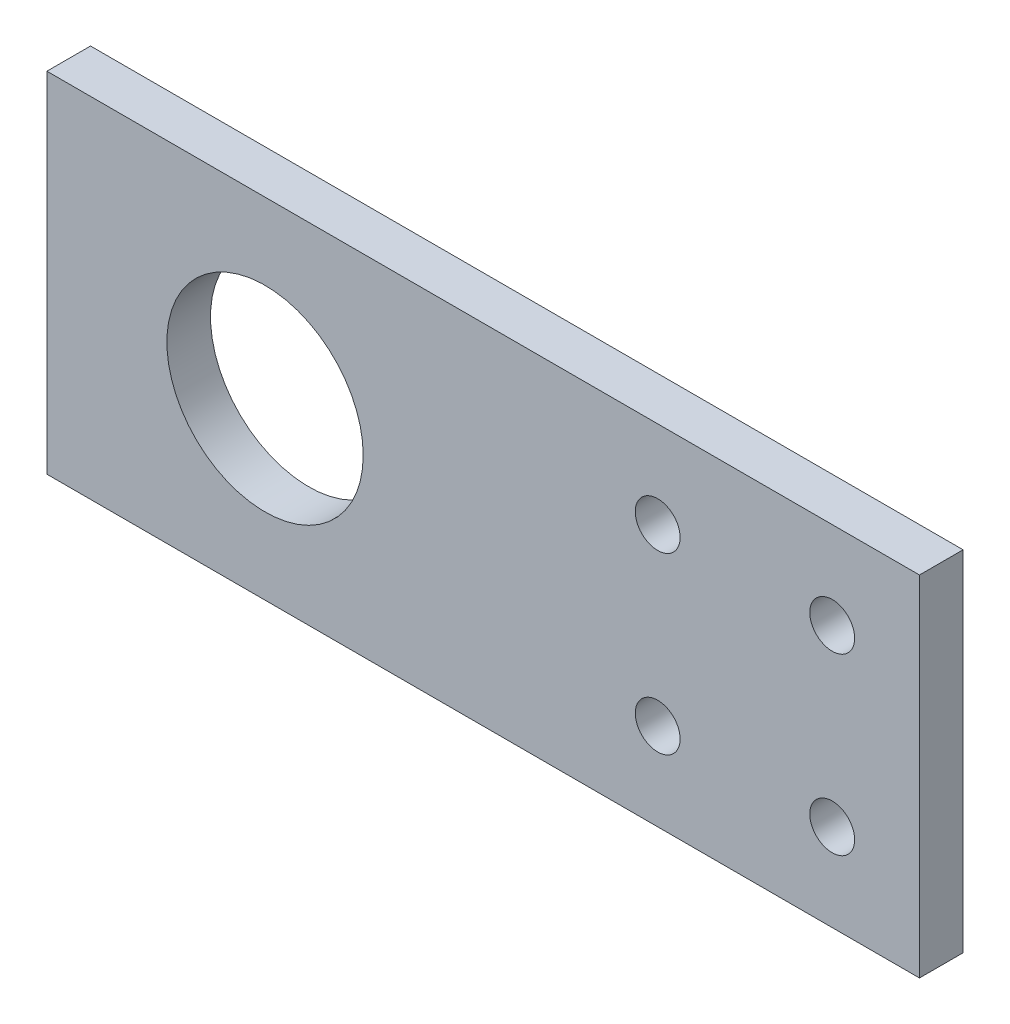
ISO-10303-21;
HEADER;
FILE_DESCRIPTION(('STEP AP214'),'2;1');
FILE_NAME('part.step','',(''),(''),'','','');
FILE_SCHEMA(('AUTOMOTIVE_DESIGN { 1 0 10303 214 1 1 1 1 }'));
ENDSEC;
DATA;
#1=APPLICATION_CONTEXT('core data for automotive mechanical design processes');
#2=APPLICATION_PROTOCOL_DEFINITION('international standard','automotive_design',2000,#1);
#3=PRODUCT_CONTEXT('',#1,'mechanical');
#4=PRODUCT('Part','Part','',(#3));
#5=PRODUCT_RELATED_PRODUCT_CATEGORY('part','',(#4));
#6=PRODUCT_DEFINITION_FORMATION('','',#4);
#7=PRODUCT_DEFINITION_CONTEXT('part definition',#1,'design');
#8=PRODUCT_DEFINITION('design','',#6,#7);
#9=PRODUCT_DEFINITION_SHAPE('','',#8);
#10=(LENGTH_UNIT() NAMED_UNIT(*) SI_UNIT(.MILLI.,.METRE.));
#11=(NAMED_UNIT(*) PLANE_ANGLE_UNIT() SI_UNIT($,.RADIAN.));
#12=(NAMED_UNIT(*) SI_UNIT($,.STERADIAN.) SOLID_ANGLE_UNIT());
#13=UNCERTAINTY_MEASURE_WITH_UNIT(LENGTH_MEASURE(1.E-05),#10,'distance_accuracy_value','');
#14=(GEOMETRIC_REPRESENTATION_CONTEXT(3) GLOBAL_UNCERTAINTY_ASSIGNED_CONTEXT((#13)) GLOBAL_UNIT_ASSIGNED_CONTEXT((#10,
#11,#12)) REPRESENTATION_CONTEXT('',''));
#15=CARTESIAN_POINT('',(0.,0.,0.));
#16=DIRECTION('',(0.,0.,1.));
#17=DIRECTION('',(1.,0.,0.));
#18=AXIS2_PLACEMENT_3D('',#15,#16,#17);
#19=CARTESIAN_POINT('',(0.,0.,3.175));
#20=DIRECTION('',(0.,0.,-1.));
#21=DIRECTION('',(-1.,0.,0.));
#22=AXIS2_PLACEMENT_3D('',#19,#20,#21);
#23=PLANE('',#22);
#24=CARTESIAN_POINT('',(31.75,25.4,3.175));
#25=DIRECTION('',(0.,0.,1.));
#26=DIRECTION('',(1.,0.,0.));
#27=AXIS2_PLACEMENT_3D('',#24,#25,#26);
#28=CIRCLE('',#27,14.2875);
#29=CARTESIAN_POINT('',(46.0375,25.4,3.175));
#30=VERTEX_POINT('',#29);
#31=EDGE_CURVE('E162',#30,#30,#28,.T.);
#32=ORIENTED_EDGE('',*,*,#31,.F.);
#33=EDGE_LOOP('',(#32));
#34=FACE_BOUND('',#33,.T.);
#35=DIRECTION('',(1.,0.,0.));
#36=VECTOR('',#35,1.);
#37=CARTESIAN_POINT('',(127.,0.,3.175));
#38=LINE('',#37,#36);
#39=CARTESIAN_POINT('',(0.,0.,3.175));
#40=VERTEX_POINT('',#39);
#41=CARTESIAN_POINT('',(127.,0.,3.175));
#42=VERTEX_POINT('',#41);
#43=EDGE_CURVE('E92',#40,#42,#38,.T.);
#44=ORIENTED_EDGE('',*,*,#43,.T.);
#45=DIRECTION('',(0.,1.,0.));
#46=VECTOR('',#45,1.);
#47=CARTESIAN_POINT('',(127.,50.8,3.175));
#48=LINE('',#47,#46);
#49=CARTESIAN_POINT('',(127.,50.8,3.175));
#50=VERTEX_POINT('',#49);
#51=EDGE_CURVE('E87',#42,#50,#48,.T.);
#52=ORIENTED_EDGE('',*,*,#51,.T.);
#53=DIRECTION('',(-1.,0.,0.));
#54=VECTOR('',#53,1.);
#55=CARTESIAN_POINT('',(127.,50.8,3.175));
#56=LINE('',#55,#54);
#57=CARTESIAN_POINT('',(0.,50.8,3.175));
#58=VERTEX_POINT('',#57);
#59=EDGE_CURVE('E90',#50,#58,#56,.T.);
#60=ORIENTED_EDGE('',*,*,#59,.T.);
#61=DIRECTION('',(0.,-1.,0.));
#62=VECTOR('',#61,1.);
#63=CARTESIAN_POINT('',(0.,0.,3.175));
#64=LINE('',#63,#62);
#65=EDGE_CURVE('E57',#58,#40,#64,.T.);
#66=ORIENTED_EDGE('',*,*,#65,.T.);
#67=EDGE_LOOP('',(#44,#52,#60,#66));
#68=FACE_BOUND('',#67,.T.);
#69=CARTESIAN_POINT('',(88.9,12.7,3.175));
#70=DIRECTION('',(0.,0.,1.));
#71=DIRECTION('',(1.,0.,0.));
#72=AXIS2_PLACEMENT_3D('',#69,#70,#71);
#73=CIRCLE('',#72,3.26389999999999);
#74=CARTESIAN_POINT('',(92.1639,12.7,3.175));
#75=VERTEX_POINT('',#74);
#76=EDGE_CURVE('E112',#75,#75,#73,.T.);
#77=ORIENTED_EDGE('',*,*,#76,.F.);
#78=EDGE_LOOP('',(#77));
#79=FACE_BOUND('',#78,.T.);
#80=CARTESIAN_POINT('',(114.3,12.7,3.175));
#81=DIRECTION('',(0.,0.,1.));
#82=DIRECTION('',(1.,0.,0.));
#83=AXIS2_PLACEMENT_3D('',#80,#81,#82);
#84=CIRCLE('',#83,3.26389999999999);
#85=CARTESIAN_POINT('',(117.5639,12.7,3.175));
#86=VERTEX_POINT('',#85);
#87=EDGE_CURVE('E134',#86,#86,#84,.T.);
#88=ORIENTED_EDGE('',*,*,#87,.F.);
#89=EDGE_LOOP('',(#88));
#90=FACE_BOUND('',#89,.T.);
#91=CARTESIAN_POINT('',(88.9,38.1,3.175));
#92=DIRECTION('',(0.,0.,1.));
#93=DIRECTION('',(1.,0.,0.));
#94=AXIS2_PLACEMENT_3D('',#91,#92,#93);
#95=CIRCLE('',#94,3.2639);
#96=CARTESIAN_POINT('',(92.1639,38.1,3.175));
#97=VERTEX_POINT('',#96);
#98=EDGE_CURVE('E142',#97,#97,#95,.T.);
#99=ORIENTED_EDGE('',*,*,#98,.F.);
#100=EDGE_LOOP('',(#99));
#101=FACE_BOUND('',#100,.T.);
#102=CARTESIAN_POINT('',(114.3,38.1,3.175));
#103=DIRECTION('',(0.,0.,1.));
#104=DIRECTION('',(1.,0.,0.));
#105=AXIS2_PLACEMENT_3D('',#102,#103,#104);
#106=CIRCLE('',#105,3.2639);
#107=CARTESIAN_POINT('',(117.5639,38.1,3.175));
#108=VERTEX_POINT('',#107);
#109=EDGE_CURVE('E150',#108,#108,#106,.T.);
#110=ORIENTED_EDGE('',*,*,#109,.F.);
#111=EDGE_LOOP('',(#110));
#112=FACE_BOUND('',#111,.T.);
#113=ADVANCED_FACE('F39',(#34,#68,#79,#90,#101,#112),#23,.F.);
#114=CARTESIAN_POINT('',(0.,0.,-3.175));
#115=DIRECTION('',(0.,0.,-1.));
#116=DIRECTION('',(-1.,0.,0.));
#117=AXIS2_PLACEMENT_3D('',#114,#115,#116);
#118=PLANE('',#117);
#119=CARTESIAN_POINT('',(31.75,25.4,-3.175));
#120=DIRECTION('',(0.,0.,1.));
#121=DIRECTION('',(1.,0.,0.));
#122=AXIS2_PLACEMENT_3D('',#119,#120,#121);
#123=CIRCLE('',#122,14.2875);
#124=CARTESIAN_POINT('',(46.0375,25.4,-3.175));
#125=VERTEX_POINT('',#124);
#126=EDGE_CURVE('E158',#125,#125,#123,.T.);
#127=ORIENTED_EDGE('',*,*,#126,.T.);
#128=EDGE_LOOP('',(#127));
#129=FACE_BOUND('',#128,.T.);
#130=CARTESIAN_POINT('',(88.9,38.1,-3.175));
#131=DIRECTION('',(0.,0.,1.));
#132=DIRECTION('',(1.,0.,0.));
#133=AXIS2_PLACEMENT_3D('',#130,#131,#132);
#134=CIRCLE('',#133,3.2639);
#135=CARTESIAN_POINT('',(92.1639,38.1,-3.175));
#136=VERTEX_POINT('',#135);
#137=EDGE_CURVE('E146',#136,#136,#134,.T.);
#138=ORIENTED_EDGE('',*,*,#137,.T.);
#139=EDGE_LOOP('',(#138));
#140=FACE_BOUND('',#139,.T.);
#141=CARTESIAN_POINT('',(88.9,12.7,-3.175));
#142=DIRECTION('',(0.,0.,1.));
#143=DIRECTION('',(1.,0.,0.));
#144=AXIS2_PLACEMENT_3D('',#141,#142,#143);
#145=CIRCLE('',#144,3.26389999999999);
#146=CARTESIAN_POINT('',(92.1639,12.7,-3.175));
#147=VERTEX_POINT('',#146);
#148=EDGE_CURVE('E130',#147,#147,#145,.T.);
#149=ORIENTED_EDGE('',*,*,#148,.T.);
#150=EDGE_LOOP('',(#149));
#151=FACE_BOUND('',#150,.T.);
#152=DIRECTION('',(1.,0.,0.));
#153=VECTOR('',#152,1.);
#154=CARTESIAN_POINT('',(127.,0.,-3.175));
#155=LINE('',#154,#153);
#156=CARTESIAN_POINT('',(0.,0.,-3.175));
#157=VERTEX_POINT('',#156);
#158=CARTESIAN_POINT('',(127.,0.,-3.175));
#159=VERTEX_POINT('',#158);
#160=EDGE_CURVE('E108',#157,#159,#155,.T.);
#161=ORIENTED_EDGE('',*,*,#160,.F.);
#162=DIRECTION('',(0.,-1.,0.));
#163=VECTOR('',#162,1.);
#164=CARTESIAN_POINT('',(0.,0.,-3.175));
#165=LINE('',#164,#163);
#166=CARTESIAN_POINT('',(0.,50.8,-3.175));
#167=VERTEX_POINT('',#166);
#168=EDGE_CURVE('E80',#167,#157,#165,.T.);
#169=ORIENTED_EDGE('',*,*,#168,.F.);
#170=DIRECTION('',(-1.,0.,0.));
#171=VECTOR('',#170,1.);
#172=CARTESIAN_POINT('',(127.,50.8,-3.175));
#173=LINE('',#172,#171);
#174=CARTESIAN_POINT('',(127.,50.8,-3.175));
#175=VERTEX_POINT('',#174);
#176=EDGE_CURVE('E74',#175,#167,#173,.T.);
#177=ORIENTED_EDGE('',*,*,#176,.F.);
#178=DIRECTION('',(0.,1.,0.));
#179=VECTOR('',#178,1.);
#180=CARTESIAN_POINT('',(127.,50.8,-3.175));
#181=LINE('',#180,#179);
#182=EDGE_CURVE('E97',#159,#175,#181,.T.);
#183=ORIENTED_EDGE('',*,*,#182,.F.);
#184=EDGE_LOOP('',(#161,#169,#177,#183));
#185=FACE_BOUND('',#184,.T.);
#186=CARTESIAN_POINT('',(114.3,12.7,-3.175));
#187=DIRECTION('',(0.,0.,1.));
#188=DIRECTION('',(1.,0.,0.));
#189=AXIS2_PLACEMENT_3D('',#186,#187,#188);
#190=CIRCLE('',#189,3.26389999999999);
#191=CARTESIAN_POINT('',(117.5639,12.7,-3.175));
#192=VERTEX_POINT('',#191);
#193=EDGE_CURVE('E138',#192,#192,#190,.T.);
#194=ORIENTED_EDGE('',*,*,#193,.T.);
#195=EDGE_LOOP('',(#194));
#196=FACE_BOUND('',#195,.T.);
#197=CARTESIAN_POINT('',(114.3,38.1,-3.175));
#198=DIRECTION('',(0.,0.,1.));
#199=DIRECTION('',(1.,0.,0.));
#200=AXIS2_PLACEMENT_3D('',#197,#198,#199);
#201=CIRCLE('',#200,3.2639);
#202=CARTESIAN_POINT('',(117.5639,38.1,-3.175));
#203=VERTEX_POINT('',#202);
#204=EDGE_CURVE('E154',#203,#203,#201,.T.);
#205=ORIENTED_EDGE('',*,*,#204,.T.);
#206=EDGE_LOOP('',(#205));
#207=FACE_BOUND('',#206,.T.);
#208=ADVANCED_FACE('F125',(#129,#140,#151,#185,#196,#207),#118,.T.);
#209=CARTESIAN_POINT('',(127.,0.,3.175));
#210=DIRECTION('',(0.,1.,0.));
#211=DIRECTION('',(-1.,0.,0.));
#212=AXIS2_PLACEMENT_3D('',#209,#210,#211);
#213=PLANE('',#212);
#214=ORIENTED_EDGE('',*,*,#160,.T.);
#215=DIRECTION('',(0.,0.,-1.));
#216=VECTOR('',#215,1.);
#217=CARTESIAN_POINT('',(127.,0.,3.175));
#218=LINE('',#217,#216);
#219=EDGE_CURVE('E11',#42,#159,#218,.T.);
#220=ORIENTED_EDGE('',*,*,#219,.F.);
#221=ORIENTED_EDGE('',*,*,#43,.F.);
#222=DIRECTION('',(0.,0.,-1.));
#223=VECTOR('',#222,1.);
#224=CARTESIAN_POINT('',(0.,0.,3.175));
#225=LINE('',#224,#223);
#226=EDGE_CURVE('E104',#40,#157,#225,.T.);
#227=ORIENTED_EDGE('',*,*,#226,.T.);
#228=EDGE_LOOP('',(#214,#220,#221,#227));
#229=FACE_BOUND('',#228,.T.);
#230=ADVANCED_FACE('F41',(#229),#213,.F.);
#231=CARTESIAN_POINT('',(127.,50.8,3.175));
#232=DIRECTION('',(-1.,0.,0.));
#233=DIRECTION('',(0.,0.,1.));
#234=AXIS2_PLACEMENT_3D('',#231,#232,#233);
#235=PLANE('',#234);
#236=ORIENTED_EDGE('',*,*,#182,.T.);
#237=DIRECTION('',(0.,0.,-1.));
#238=VECTOR('',#237,1.);
#239=CARTESIAN_POINT('',(127.,50.8,3.175));
#240=LINE('',#239,#238);
#241=EDGE_CURVE('E49',#50,#175,#240,.T.);
#242=ORIENTED_EDGE('',*,*,#241,.F.);
#243=ORIENTED_EDGE('',*,*,#51,.F.);
#244=ORIENTED_EDGE('',*,*,#219,.T.);
#245=EDGE_LOOP('',(#236,#242,#243,#244));
#246=FACE_BOUND('',#245,.T.);
#247=ADVANCED_FACE('F96',(#246),#235,.F.);
#248=CARTESIAN_POINT('',(127.,50.8,3.175));
#249=DIRECTION('',(0.,-1.,0.));
#250=DIRECTION('',(1.,0.,0.));
#251=AXIS2_PLACEMENT_3D('',#248,#249,#250);
#252=PLANE('',#251);
#253=ORIENTED_EDGE('',*,*,#176,.T.);
#254=DIRECTION('',(0.,0.,-1.));
#255=VECTOR('',#254,1.);
#256=CARTESIAN_POINT('',(0.,50.8,3.175));
#257=LINE('',#256,#255);
#258=EDGE_CURVE('E99',#58,#167,#257,.T.);
#259=ORIENTED_EDGE('',*,*,#258,.F.);
#260=ORIENTED_EDGE('',*,*,#59,.F.);
#261=ORIENTED_EDGE('',*,*,#241,.T.);
#262=EDGE_LOOP('',(#253,#259,#260,#261));
#263=FACE_BOUND('',#262,.T.);
#264=ADVANCED_FACE('F100',(#263),#252,.F.);
#265=CARTESIAN_POINT('',(0.,0.,3.175));
#266=DIRECTION('',(1.,0.,0.));
#267=DIRECTION('',(0.,0.,-1.));
#268=AXIS2_PLACEMENT_3D('',#265,#266,#267);
#269=PLANE('',#268);
#270=ORIENTED_EDGE('',*,*,#168,.T.);
#271=ORIENTED_EDGE('',*,*,#226,.F.);
#272=ORIENTED_EDGE('',*,*,#65,.F.);
#273=ORIENTED_EDGE('',*,*,#258,.T.);
#274=EDGE_LOOP('',(#270,#271,#272,#273));
#275=FACE_BOUND('',#274,.T.);
#276=ADVANCED_FACE('F122',(#275),#269,.F.);
#277=CARTESIAN_POINT('',(88.9,12.7,3.175));
#278=DIRECTION('',(0.,0.,-1.));
#279=DIRECTION('',(-1.,0.,0.));
#280=AXIS2_PLACEMENT_3D('',#277,#278,#279);
#281=CYLINDRICAL_SURFACE('',#280,3.26389999999999);
#282=ORIENTED_EDGE('',*,*,#76,.T.);
#283=EDGE_LOOP('',(#282));
#284=FACE_BOUND('',#283,.T.);
#285=ORIENTED_EDGE('',*,*,#148,.F.);
#286=EDGE_LOOP('',(#285));
#287=FACE_BOUND('',#286,.T.);
#288=ADVANCED_FACE('F186',(#284,#287),#281,.F.);
#289=CARTESIAN_POINT('',(114.3,12.7,3.175));
#290=DIRECTION('',(0.,0.,-1.));
#291=DIRECTION('',(-1.,0.,0.));
#292=AXIS2_PLACEMENT_3D('',#289,#290,#291);
#293=CYLINDRICAL_SURFACE('',#292,3.26389999999999);
#294=ORIENTED_EDGE('',*,*,#87,.T.);
#295=EDGE_LOOP('',(#294));
#296=FACE_BOUND('',#295,.T.);
#297=ORIENTED_EDGE('',*,*,#193,.F.);
#298=EDGE_LOOP('',(#297));
#299=FACE_BOUND('',#298,.T.);
#300=ADVANCED_FACE('F226',(#296,#299),#293,.F.);
#301=CARTESIAN_POINT('',(88.9,38.1,3.175));
#302=DIRECTION('',(0.,0.,-1.));
#303=DIRECTION('',(-1.,0.,0.));
#304=AXIS2_PLACEMENT_3D('',#301,#302,#303);
#305=CYLINDRICAL_SURFACE('',#304,3.2639);
#306=ORIENTED_EDGE('',*,*,#98,.T.);
#307=EDGE_LOOP('',(#306));
#308=FACE_BOUND('',#307,.T.);
#309=ORIENTED_EDGE('',*,*,#137,.F.);
#310=EDGE_LOOP('',(#309));
#311=FACE_BOUND('',#310,.T.);
#312=ADVANCED_FACE('F219',(#308,#311),#305,.F.);
#313=CARTESIAN_POINT('',(114.3,38.1,3.175));
#314=DIRECTION('',(0.,0.,-1.));
#315=DIRECTION('',(-1.,0.,0.));
#316=AXIS2_PLACEMENT_3D('',#313,#314,#315);
#317=CYLINDRICAL_SURFACE('',#316,3.2639);
#318=ORIENTED_EDGE('',*,*,#109,.T.);
#319=EDGE_LOOP('',(#318));
#320=FACE_BOUND('',#319,.T.);
#321=ORIENTED_EDGE('',*,*,#204,.F.);
#322=EDGE_LOOP('',(#321));
#323=FACE_BOUND('',#322,.T.);
#324=ADVANCED_FACE('F175',(#320,#323),#317,.F.);
#325=CARTESIAN_POINT('',(31.75,25.4,-3.175));
#326=DIRECTION('',(0.,0.,1.));
#327=DIRECTION('',(1.,0.,0.));
#328=AXIS2_PLACEMENT_3D('',#325,#326,#327);
#329=CYLINDRICAL_SURFACE('',#328,14.2875);
#330=ORIENTED_EDGE('',*,*,#126,.F.);
#331=EDGE_LOOP('',(#330));
#332=FACE_BOUND('',#331,.T.);
#333=ORIENTED_EDGE('',*,*,#31,.T.);
#334=EDGE_LOOP('',(#333));
#335=FACE_BOUND('',#334,.T.);
#336=ADVANCED_FACE('F172',(#332,#335),#329,.F.);
#337=CLOSED_SHELL('',(#113,#208,#230,#247,#264,#276,#288,#300,#312,#324,#336));
#338=MANIFOLD_SOLID_BREP('B2',#337);
#339=ADVANCED_BREP_SHAPE_REPRESENTATION('',(#18,#338),#14);
#340=SHAPE_DEFINITION_REPRESENTATION(#9,#339);
ENDSEC;
END-ISO-10303-21;
